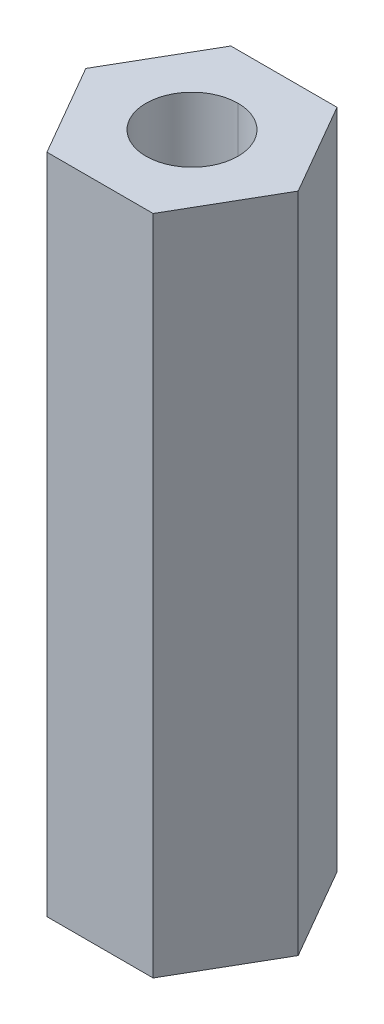
ISO-10303-21;
HEADER;
FILE_DESCRIPTION(('STEP AP214'),'2;1');
FILE_NAME('part.step','',(''),(''),'','','');
FILE_SCHEMA(('AUTOMOTIVE_DESIGN { 1 0 10303 214 1 1 1 1 }'));
ENDSEC;
DATA;
#1=APPLICATION_CONTEXT('core data for automotive mechanical design processes');
#2=APPLICATION_PROTOCOL_DEFINITION('international standard','automotive_design',2000,#1);
#3=PRODUCT_CONTEXT('',#1,'mechanical');
#4=PRODUCT('Part','Part','',(#3));
#5=PRODUCT_RELATED_PRODUCT_CATEGORY('part','',(#4));
#6=PRODUCT_DEFINITION_FORMATION('','',#4);
#7=PRODUCT_DEFINITION_CONTEXT('part definition',#1,'design');
#8=PRODUCT_DEFINITION('design','',#6,#7);
#9=PRODUCT_DEFINITION_SHAPE('','',#8);
#10=(LENGTH_UNIT() NAMED_UNIT(*) SI_UNIT(.MILLI.,.METRE.));
#11=(NAMED_UNIT(*) PLANE_ANGLE_UNIT() SI_UNIT($,.RADIAN.));
#12=(NAMED_UNIT(*) SI_UNIT($,.STERADIAN.) SOLID_ANGLE_UNIT());
#13=UNCERTAINTY_MEASURE_WITH_UNIT(LENGTH_MEASURE(1.E-05),#10,'distance_accuracy_value','');
#14=(GEOMETRIC_REPRESENTATION_CONTEXT(3) GLOBAL_UNCERTAINTY_ASSIGNED_CONTEXT((#13)) GLOBAL_UNIT_ASSIGNED_CONTEXT((#10,
#11,#12)) REPRESENTATION_CONTEXT('',''));
#15=CARTESIAN_POINT('',(0.,0.,0.));
#16=DIRECTION('',(0.,0.,1.));
#17=DIRECTION('',(1.,0.,0.));
#18=AXIS2_PLACEMENT_3D('',#15,#16,#17);
#19=CARTESIAN_POINT('',(0.,18.,0.));
#20=DIRECTION('',(0.,-1.,0.));
#21=DIRECTION('',(0.,0.,-1.));
#22=AXIS2_PLACEMENT_3D('',#19,#20,#21);
#23=CYLINDRICAL_SURFACE('',#22,1.25);
#24=DIRECTION('',(0.,-1.,0.));
#25=VECTOR('',#24,1.);
#26=CARTESIAN_POINT('',(0.,18.,1.25));
#27=LINE('',#26,#25);
#28=CARTESIAN_POINT('',(0.,18.,1.25));
#29=VERTEX_POINT('',#28);
#30=CARTESIAN_POINT('',(0.,0.,1.25));
#31=VERTEX_POINT('',#30);
#32=EDGE_CURVE('E184',#29,#31,#27,.T.);
#33=ORIENTED_EDGE('',*,*,#32,.F.);
#34=CARTESIAN_POINT('',(0.,18.,0.));
#35=DIRECTION('',(0.,1.,0.));
#36=DIRECTION('',(0.,0.,1.));
#37=AXIS2_PLACEMENT_3D('',#34,#35,#36);
#38=CIRCLE('',#37,1.25);
#39=CARTESIAN_POINT('',(0.,18.,-1.25));
#40=VERTEX_POINT('',#39);
#41=EDGE_CURVE('E149',#29,#40,#38,.T.);
#42=ORIENTED_EDGE('',*,*,#41,.T.);
#43=DIRECTION('',(0.,-1.,0.));
#44=VECTOR('',#43,1.);
#45=CARTESIAN_POINT('',(0.,18.,-1.25));
#46=LINE('',#45,#44);
#47=CARTESIAN_POINT('',(0.,0.,-1.25));
#48=VERTEX_POINT('',#47);
#49=EDGE_CURVE('E183',#40,#48,#46,.T.);
#50=ORIENTED_EDGE('',*,*,#49,.T.);
#51=CARTESIAN_POINT('',(0.,0.,0.));
#52=DIRECTION('',(0.,1.,0.));
#53=DIRECTION('',(0.,0.,1.));
#54=AXIS2_PLACEMENT_3D('',#51,#52,#53);
#55=CIRCLE('',#54,1.25);
#56=EDGE_CURVE('E89',#31,#48,#55,.T.);
#57=ORIENTED_EDGE('',*,*,#56,.F.);
#58=EDGE_LOOP('',(#33,#42,#50,#57));
#59=FACE_BOUND('',#58,.T.);
#60=ADVANCED_FACE('F17',(#59),#23,.F.);
#61=CARTESIAN_POINT('',(-2.88675134594813,18.,0.));
#62=DIRECTION('',(0.866025403784439,0.,-0.5));
#63=DIRECTION('',(0.,-1.,0.));
#64=AXIS2_PLACEMENT_3D('',#61,#62,#63);
#65=PLANE('',#64);
#66=DIRECTION('',(0.5,0.,0.866025403784439));
#67=VECTOR('',#66,1.);
#68=CARTESIAN_POINT('',(-2.88675134594813,0.,0.));
#69=LINE('',#68,#67);
#70=CARTESIAN_POINT('',(-2.88675134594813,0.,0.));
#71=VERTEX_POINT('',#70);
#72=CARTESIAN_POINT('',(-1.44337567297406,0.,2.5));
#73=VERTEX_POINT('',#72);
#74=EDGE_CURVE('E139',#71,#73,#69,.T.);
#75=ORIENTED_EDGE('',*,*,#74,.T.);
#76=DIRECTION('',(0.,-1.,0.));
#77=VECTOR('',#76,1.);
#78=CARTESIAN_POINT('',(-1.44337567297406,18.,2.5));
#79=LINE('',#78,#77);
#80=CARTESIAN_POINT('',(-1.44337567297406,18.,2.5));
#81=VERTEX_POINT('',#80);
#82=EDGE_CURVE('E129',#81,#73,#79,.T.);
#83=ORIENTED_EDGE('',*,*,#82,.F.);
#84=DIRECTION('',(0.5,0.,0.866025403784439));
#85=VECTOR('',#84,1.);
#86=CARTESIAN_POINT('',(-2.88675134594813,18.,0.));
#87=LINE('',#86,#85);
#88=CARTESIAN_POINT('',(-2.88675134594813,18.,0.));
#89=VERTEX_POINT('',#88);
#90=EDGE_CURVE('E156',#89,#81,#87,.T.);
#91=ORIENTED_EDGE('',*,*,#90,.F.);
#92=DIRECTION('',(0.,-1.,0.));
#93=VECTOR('',#92,1.);
#94=CARTESIAN_POINT('',(-2.88675134594813,18.,0.));
#95=LINE('',#94,#93);
#96=EDGE_CURVE('E11',#89,#71,#95,.T.);
#97=ORIENTED_EDGE('',*,*,#96,.T.);
#98=EDGE_LOOP('',(#75,#83,#91,#97));
#99=FACE_BOUND('',#98,.T.);
#100=ADVANCED_FACE('F19',(#99),#65,.F.);
#101=CARTESIAN_POINT('',(-1.44337567297406,18.,-2.5));
#102=DIRECTION('',(0.866025403784439,0.,0.5));
#103=DIRECTION('',(0.,-1.,0.));
#104=AXIS2_PLACEMENT_3D('',#101,#102,#103);
#105=PLANE('',#104);
#106=DIRECTION('',(-0.5,0.,0.866025403784439));
#107=VECTOR('',#106,1.);
#108=CARTESIAN_POINT('',(-1.44337567297406,0.,-2.5));
#109=LINE('',#108,#107);
#110=CARTESIAN_POINT('',(-1.44337567297406,0.,-2.5));
#111=VERTEX_POINT('',#110);
#112=EDGE_CURVE('E143',#111,#71,#109,.T.);
#113=ORIENTED_EDGE('',*,*,#112,.T.);
#114=ORIENTED_EDGE('',*,*,#96,.F.);
#115=DIRECTION('',(-0.5,0.,0.866025403784439));
#116=VECTOR('',#115,1.);
#117=CARTESIAN_POINT('',(-1.44337567297406,18.,-2.5));
#118=LINE('',#117,#116);
#119=CARTESIAN_POINT('',(-1.44337567297406,18.,-2.5));
#120=VERTEX_POINT('',#119);
#121=EDGE_CURVE('E176',#120,#89,#118,.T.);
#122=ORIENTED_EDGE('',*,*,#121,.F.);
#123=DIRECTION('',(0.,-1.,0.));
#124=VECTOR('',#123,1.);
#125=CARTESIAN_POINT('',(-1.44337567297406,18.,-2.5));
#126=LINE('',#125,#124);
#127=EDGE_CURVE('E28',#120,#111,#126,.T.);
#128=ORIENTED_EDGE('',*,*,#127,.T.);
#129=EDGE_LOOP('',(#113,#114,#122,#128));
#130=FACE_BOUND('',#129,.T.);
#131=ADVANCED_FACE('F331',(#130),#105,.F.);
#132=CARTESIAN_POINT('',(1.44337567297406,18.,-2.5));
#133=DIRECTION('',(0.,0.,1.));
#134=DIRECTION('',(1.,0.,0.));
#135=AXIS2_PLACEMENT_3D('',#132,#133,#134);
#136=PLANE('',#135);
#137=DIRECTION('',(-1.,0.,0.));
#138=VECTOR('',#137,1.);
#139=CARTESIAN_POINT('',(1.44337567297406,0.,-2.5));
#140=LINE('',#139,#138);
#141=CARTESIAN_POINT('',(1.44337567297406,0.,-2.5));
#142=VERTEX_POINT('',#141);
#143=EDGE_CURVE('E165',#142,#111,#140,.T.);
#144=ORIENTED_EDGE('',*,*,#143,.T.);
#145=ORIENTED_EDGE('',*,*,#127,.F.);
#146=DIRECTION('',(-1.,0.,0.));
#147=VECTOR('',#146,1.);
#148=CARTESIAN_POINT('',(1.44337567297406,18.,-2.5));
#149=LINE('',#148,#147);
#150=CARTESIAN_POINT('',(1.44337567297406,18.,-2.5));
#151=VERTEX_POINT('',#150);
#152=EDGE_CURVE('E172',#151,#120,#149,.T.);
#153=ORIENTED_EDGE('',*,*,#152,.F.);
#154=DIRECTION('',(0.,-1.,0.));
#155=VECTOR('',#154,1.);
#156=CARTESIAN_POINT('',(1.44337567297406,18.,-2.5));
#157=LINE('',#156,#155);
#158=EDGE_CURVE('E189',#151,#142,#157,.T.);
#159=ORIENTED_EDGE('',*,*,#158,.T.);
#160=EDGE_LOOP('',(#144,#145,#153,#159));
#161=FACE_BOUND('',#160,.T.);
#162=ADVANCED_FACE('F284',(#161),#136,.F.);
#163=CARTESIAN_POINT('',(2.88675134594813,18.,0.));
#164=DIRECTION('',(-0.866025403784439,0.,0.5));
#165=DIRECTION('',(0.,1.,0.));
#166=AXIS2_PLACEMENT_3D('',#163,#164,#165);
#167=PLANE('',#166);
#168=DIRECTION('',(-0.5,0.,-0.866025403784438));
#169=VECTOR('',#168,1.);
#170=CARTESIAN_POINT('',(2.88675134594813,0.,0.));
#171=LINE('',#170,#169);
#172=CARTESIAN_POINT('',(2.88675134594813,0.,0.));
#173=VERTEX_POINT('',#172);
#174=EDGE_CURVE('E162',#173,#142,#171,.T.);
#175=ORIENTED_EDGE('',*,*,#174,.T.);
#176=ORIENTED_EDGE('',*,*,#158,.F.);
#177=DIRECTION('',(-0.5,0.,-0.866025403784438));
#178=VECTOR('',#177,1.);
#179=CARTESIAN_POINT('',(2.88675134594813,18.,0.));
#180=LINE('',#179,#178);
#181=CARTESIAN_POINT('',(2.88675134594813,18.,0.));
#182=VERTEX_POINT('',#181);
#183=EDGE_CURVE('E160',#182,#151,#180,.T.);
#184=ORIENTED_EDGE('',*,*,#183,.F.);
#185=DIRECTION('',(0.,-1.,0.));
#186=VECTOR('',#185,1.);
#187=CARTESIAN_POINT('',(2.88675134594813,18.,0.));
#188=LINE('',#187,#186);
#189=EDGE_CURVE('E43',#182,#173,#188,.T.);
#190=ORIENTED_EDGE('',*,*,#189,.T.);
#191=EDGE_LOOP('',(#175,#176,#184,#190));
#192=FACE_BOUND('',#191,.T.);
#193=ADVANCED_FACE('F278',(#192),#167,.F.);
#194=CARTESIAN_POINT('',(1.44337567297406,18.,2.5));
#195=DIRECTION('',(-0.866025403784439,0.,-0.5));
#196=DIRECTION('',(-0.5,0.,0.866025403784439));
#197=AXIS2_PLACEMENT_3D('',#194,#195,#196);
#198=PLANE('',#197);
#199=DIRECTION('',(0.5,0.,-0.866025403784439));
#200=VECTOR('',#199,1.);
#201=CARTESIAN_POINT('',(1.44337567297406,0.,2.5));
#202=LINE('',#201,#200);
#203=CARTESIAN_POINT('',(1.44337567297406,0.,2.5));
#204=VERTEX_POINT('',#203);
#205=EDGE_CURVE('E147',#204,#173,#202,.T.);
#206=ORIENTED_EDGE('',*,*,#205,.T.);
#207=ORIENTED_EDGE('',*,*,#189,.F.);
#208=DIRECTION('',(0.5,0.,-0.866025403784439));
#209=VECTOR('',#208,1.);
#210=CARTESIAN_POINT('',(1.44337567297406,18.,2.5));
#211=LINE('',#210,#209);
#212=CARTESIAN_POINT('',(1.44337567297406,18.,2.5));
#213=VERTEX_POINT('',#212);
#214=EDGE_CURVE('E177',#213,#182,#211,.T.);
#215=ORIENTED_EDGE('',*,*,#214,.F.);
#216=DIRECTION('',(0.,-1.,0.));
#217=VECTOR('',#216,1.);
#218=CARTESIAN_POINT('',(1.44337567297406,18.,2.5));
#219=LINE('',#218,#217);
#220=EDGE_CURVE('E120',#213,#204,#219,.T.);
#221=ORIENTED_EDGE('',*,*,#220,.T.);
#222=EDGE_LOOP('',(#206,#207,#215,#221));
#223=FACE_BOUND('',#222,.T.);
#224=ADVANCED_FACE('F283',(#223),#198,.F.);
#225=CARTESIAN_POINT('',(-1.44337567297406,18.,2.5));
#226=DIRECTION('',(0.,0.,-1.));
#227=DIRECTION('',(0.,-1.,0.));
#228=AXIS2_PLACEMENT_3D('',#225,#226,#227);
#229=PLANE('',#228);
#230=DIRECTION('',(1.,0.,0.));
#231=VECTOR('',#230,1.);
#232=CARTESIAN_POINT('',(-1.44337567297406,0.,2.5));
#233=LINE('',#232,#231);
#234=EDGE_CURVE('E132',#73,#204,#233,.T.);
#235=ORIENTED_EDGE('',*,*,#234,.T.);
#236=ORIENTED_EDGE('',*,*,#220,.F.);
#237=DIRECTION('',(1.,0.,0.));
#238=VECTOR('',#237,1.);
#239=CARTESIAN_POINT('',(-1.44337567297406,18.,2.5));
#240=LINE('',#239,#238);
#241=EDGE_CURVE('E134',#81,#213,#240,.T.);
#242=ORIENTED_EDGE('',*,*,#241,.F.);
#243=ORIENTED_EDGE('',*,*,#82,.T.);
#244=EDGE_LOOP('',(#235,#236,#242,#243));
#245=FACE_BOUND('',#244,.T.);
#246=ADVANCED_FACE('F130',(#245),#229,.F.);
#247=CARTESIAN_POINT('',(0.,0.,0.));
#248=DIRECTION('',(0.,1.,0.));
#249=DIRECTION('',(1.,0.,0.));
#250=AXIS2_PLACEMENT_3D('',#247,#248,#249);
#251=PLANE('',#250);
#252=CARTESIAN_POINT('',(0.,0.,0.));
#253=DIRECTION('',(0.,1.,0.));
#254=DIRECTION('',(0.,0.,1.));
#255=AXIS2_PLACEMENT_3D('',#252,#253,#254);
#256=CIRCLE('',#255,1.25);
#257=EDGE_CURVE('E21',#48,#31,#256,.T.);
#258=ORIENTED_EDGE('',*,*,#257,.T.);
#259=ORIENTED_EDGE('',*,*,#56,.T.);
#260=EDGE_LOOP('',(#258,#259));
#261=FACE_BOUND('',#260,.T.);
#262=ORIENTED_EDGE('',*,*,#234,.F.);
#263=ORIENTED_EDGE('',*,*,#74,.F.);
#264=ORIENTED_EDGE('',*,*,#112,.F.);
#265=ORIENTED_EDGE('',*,*,#143,.F.);
#266=ORIENTED_EDGE('',*,*,#174,.F.);
#267=ORIENTED_EDGE('',*,*,#205,.F.);
#268=EDGE_LOOP('',(#262,#263,#264,#265,#266,#267));
#269=FACE_BOUND('',#268,.T.);
#270=ADVANCED_FACE('F145',(#261,#269),#251,.F.);
#271=CARTESIAN_POINT('',(0.,18.,0.));
#272=DIRECTION('',(0.,1.,0.));
#273=DIRECTION('',(1.,0.,0.));
#274=AXIS2_PLACEMENT_3D('',#271,#272,#273);
#275=PLANE('',#274);
#276=CARTESIAN_POINT('',(0.,18.,0.));
#277=DIRECTION('',(0.,1.,0.));
#278=DIRECTION('',(0.,0.,1.));
#279=AXIS2_PLACEMENT_3D('',#276,#277,#278);
#280=CIRCLE('',#279,1.25);
#281=EDGE_CURVE('E188',#40,#29,#280,.T.);
#282=ORIENTED_EDGE('',*,*,#281,.F.);
#283=ORIENTED_EDGE('',*,*,#41,.F.);
#284=EDGE_LOOP('',(#282,#283));
#285=FACE_BOUND('',#284,.T.);
#286=ORIENTED_EDGE('',*,*,#241,.T.);
#287=ORIENTED_EDGE('',*,*,#214,.T.);
#288=ORIENTED_EDGE('',*,*,#183,.T.);
#289=ORIENTED_EDGE('',*,*,#152,.T.);
#290=ORIENTED_EDGE('',*,*,#121,.T.);
#291=ORIENTED_EDGE('',*,*,#90,.T.);
#292=EDGE_LOOP('',(#286,#287,#288,#289,#290,#291));
#293=FACE_BOUND('',#292,.T.);
#294=ADVANCED_FACE('F215',(#285,#293),#275,.T.);
#295=CARTESIAN_POINT('',(0.,18.,0.));
#296=DIRECTION('',(0.,-1.,0.));
#297=DIRECTION('',(0.,0.,-1.));
#298=AXIS2_PLACEMENT_3D('',#295,#296,#297);
#299=CYLINDRICAL_SURFACE('',#298,1.25);
#300=ORIENTED_EDGE('',*,*,#281,.T.);
#301=ORIENTED_EDGE('',*,*,#32,.T.);
#302=ORIENTED_EDGE('',*,*,#257,.F.);
#303=ORIENTED_EDGE('',*,*,#49,.F.);
#304=EDGE_LOOP('',(#300,#301,#302,#303));
#305=FACE_BOUND('',#304,.T.);
#306=ADVANCED_FACE('F212',(#305),#299,.F.);
#307=CLOSED_SHELL('',(#60,#100,#131,#162,#193,#224,#246,#270,#294,#306));
#308=MANIFOLD_SOLID_BREP('B1',#307);
#309=ADVANCED_BREP_SHAPE_REPRESENTATION('',(#18,#308),#14);
#310=SHAPE_DEFINITION_REPRESENTATION(#9,#309);
ENDSEC;
END-ISO-10303-21;
